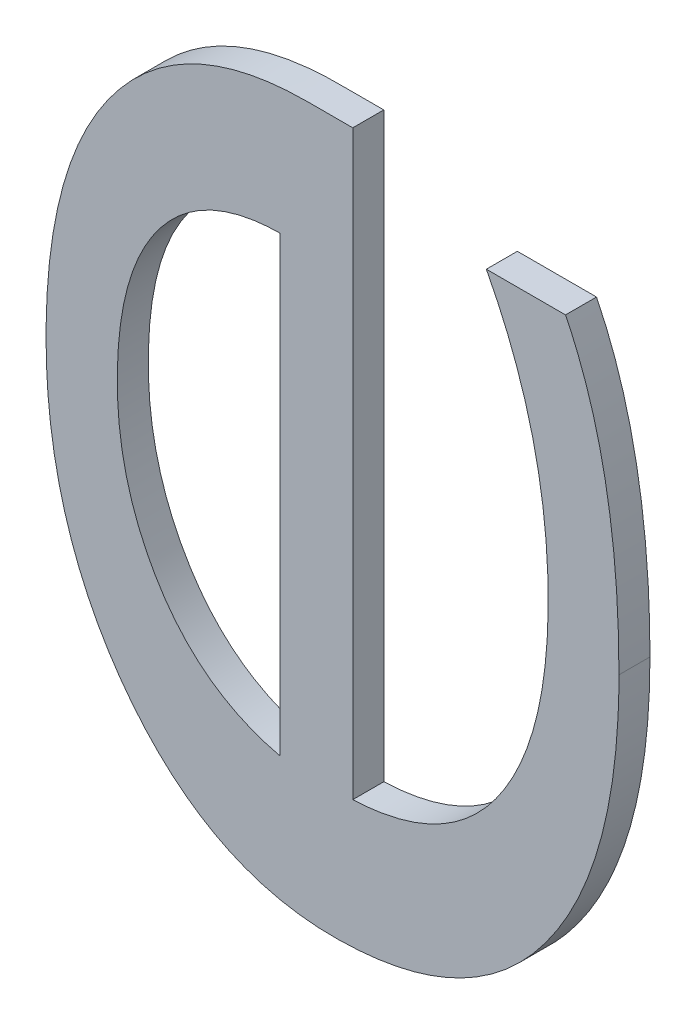
ISO-10303-21;
HEADER;
FILE_DESCRIPTION(('STEP AP214'),'2;1');
FILE_NAME('part.step','',(''),(''),'','','');
FILE_SCHEMA(('AUTOMOTIVE_DESIGN { 1 0 10303 214 1 1 1 1 }'));
ENDSEC;
DATA;
#1=APPLICATION_CONTEXT('core data for automotive mechanical design processes');
#2=APPLICATION_PROTOCOL_DEFINITION('international standard','automotive_design',2000,#1);
#3=PRODUCT_CONTEXT('',#1,'mechanical');
#4=PRODUCT('Part','Part','',(#3));
#5=PRODUCT_RELATED_PRODUCT_CATEGORY('part','',(#4));
#6=PRODUCT_DEFINITION_FORMATION('','',#4);
#7=PRODUCT_DEFINITION_CONTEXT('part definition',#1,'design');
#8=PRODUCT_DEFINITION('design','',#6,#7);
#9=PRODUCT_DEFINITION_SHAPE('','',#8);
#10=(LENGTH_UNIT() NAMED_UNIT(*) SI_UNIT(.MILLI.,.METRE.));
#11=(NAMED_UNIT(*) PLANE_ANGLE_UNIT() SI_UNIT($,.RADIAN.));
#12=(NAMED_UNIT(*) SI_UNIT($,.STERADIAN.) SOLID_ANGLE_UNIT());
#13=UNCERTAINTY_MEASURE_WITH_UNIT(LENGTH_MEASURE(1.E-05),#10,'distance_accuracy_value','');
#14=(GEOMETRIC_REPRESENTATION_CONTEXT(3) GLOBAL_UNCERTAINTY_ASSIGNED_CONTEXT((#13)) GLOBAL_UNIT_ASSIGNED_CONTEXT((#10,
#11,#12)) REPRESENTATION_CONTEXT('',''));
#15=CARTESIAN_POINT('',(0.,0.,0.));
#16=DIRECTION('',(0.,0.,1.));
#17=DIRECTION('',(1.,0.,0.));
#18=AXIS2_PLACEMENT_3D('',#15,#16,#17);
#19=CARTESIAN_POINT('',(-8.95983005625009,-22.7704584365744,333.160489148867));
#20=DIRECTION('',(0.,0.,1.));
#21=DIRECTION('',(1.,0.,0.));
#22=AXIS2_PLACEMENT_3D('',#19,#20,#21);
#23=PLANE('',#22);
#24=DIRECTION('',(1.,0.,0.));
#25=VECTOR('',#24,1.);
#26=CARTESIAN_POINT('',(2.66453525910038E-13,-55.8457304646788,333.160489148867));
#27=LINE('',#26,#25);
#28=CARTESIAN_POINT('',(-7.57343995709141,-55.8457304646788,333.160489148867));
#29=VERTEX_POINT('',#28);
#30=CARTESIAN_POINT('',(-6.80721399555295,-55.8457304646788,333.160489148867));
#31=VERTEX_POINT('',#30);
#32=EDGE_CURVE('E173',#29,#31,#27,.T.);
#33=ORIENTED_EDGE('',*,*,#32,.T.);
#34=CARTESIAN_POINT('',(-6.80721399555295,-55.8457304646788,333.160489148867));
#35=CARTESIAN_POINT('',(-6.46241231286064,-56.5401231164568,333.160489148867));
#36=CARTESIAN_POINT('',(-6.29001147151449,-57.459594270303,333.160489148867));
#37=CARTESIAN_POINT('',(-6.29001147151449,-58.6041438736047,333.160489148867));
#38=(BOUNDED_CURVE() B_SPLINE_CURVE(3,(#34,#35,#36,#37),.UNSPECIFIED.,.F.,
.F.) B_SPLINE_CURVE_WITH_KNOTS((4,4),(0.,1.),
.UNSPECIFIED.) CURVE() GEOMETRIC_REPRESENTATION_ITEM() RATIONAL_B_SPLINE_CURVE((1.,1.,1.,1.)) REPRESENTATION_ITEM(''));
#39=CARTESIAN_POINT('',(-6.29001147151449,-58.6041438736047,333.160489148867));
#40=VERTEX_POINT('',#39);
#41=EDGE_CURVE('E11',#31,#40,#38,.T.);
#42=ORIENTED_EDGE('',*,*,#41,.T.);
#43=CARTESIAN_POINT('',(-6.29001147151449,-58.6041438736047,333.160489148867));
#44=CARTESIAN_POINT('',(-6.29001147151449,-59.7103826581884,333.160489148867));
#45=CARTESIAN_POINT('',(-6.53105361618762,-60.5831615577967,333.160489148867));
#46=CARTESIAN_POINT('',(-7.495220558006,-61.8618014908206,333.160489148867));
#47=CARTESIAN_POINT('',(-8.17365004420736,-62.18146138415,333.160489148867));
#48=CARTESIAN_POINT('',(-9.85296219266834,-62.18146138415,333.160489148867));
#49=CARTESIAN_POINT('',(-10.5186208615181,-61.8354625575112,333.160489148867));
#50=CARTESIAN_POINT('',(-11.5721816938703,-60.4514669238973,333.160489148867));
#51=CARTESIAN_POINT('',(-11.8355718681491,-59.5858710329719,333.160489148867));
#52=CARTESIAN_POINT('',(-11.8355718681491,-57.5266386678038,333.160489148867));
#53=CARTESIAN_POINT('',(-11.6120895507701,-56.7316790243558,333.160489148867));
#54=CARTESIAN_POINT('',(-10.7181588828609,-55.591918489053,333.160489148867));
#55=CARTESIAN_POINT('',(-10.0956002891109,-55.3069778354721,333.160489148867));
#56=CARTESIAN_POINT('',(-9.15378100276449,-55.3069778354721,333.160489148867));
#57=CARTESIAN_POINT('',(-9.01011363497603,-55.3069778354721,333.160489148867));
#58=CARTESIAN_POINT('',(-8.86644626718757,-55.3069778354721,333.160489148867));
#59=(BOUNDED_CURVE() B_SPLINE_CURVE(3,(#43,#44,#45,#46,#47,#48,#49,#50,#51,#52,#53,#54,#55,#56,
#57,#58),.UNSPECIFIED.,.F.,.F.) B_SPLINE_CURVE_WITH_KNOTS((4,2,2,2,2,2,2,4),(0.,
0.172193607508208,0.344387118133516,0.50275482727622,0.661122495762255,0.816570914673487,
0.972019288363763,1.),
.UNSPECIFIED.) CURVE() GEOMETRIC_REPRESENTATION_ITEM() RATIONAL_B_SPLINE_CURVE((1.,1.,1.,1.,1.,
1.,1.,1.,1.,1.,1.,1.,1.,1.,1.,1.)) REPRESENTATION_ITEM(''));
#60=CARTESIAN_POINT('',(-8.86644626718757,-55.3069778354721,333.160489148867));
#61=VERTEX_POINT('',#60);
#62=EDGE_CURVE('E115',#40,#61,#59,.T.);
#63=ORIENTED_EDGE('',*,*,#62,.T.);
#64=DIRECTION('',(0.,-1.,0.));
#65=VECTOR('',#64,1.);
#66=CARTESIAN_POINT('',(-8.86644626718757,-50.9500000001419,333.160489148867));
#67=LINE('',#66,#65);
#68=CARTESIAN_POINT('',(-8.86644626718757,-60.9387386527798,333.160489148867));
#69=VERTEX_POINT('',#68);
#70=EDGE_CURVE('E117',#61,#69,#67,.T.);
#71=ORIENTED_EDGE('',*,*,#70,.T.);
#72=CARTESIAN_POINT('',(-8.86644626718757,-60.9387386527798,333.160489148867));
#73=CARTESIAN_POINT('',(-8.25665798141862,-60.9147941850151,333.160489148867));
#74=CARTESIAN_POINT('',(-7.78894100877411,-60.6729540223711,333.160489148867));
#75=CARTESIAN_POINT('',(-7.13764894146642,-59.753482868525,333.160489148867));
#76=CARTESIAN_POINT('',(-6.97482592463949,-59.1237410934524,333.160489148867));
#77=CARTESIAN_POINT('',(-6.97482592463949,-57.4284661535486,333.160489148867));
#78=CARTESIAN_POINT('',(-7.17436418487931,-56.6023787887649,333.160489148867));
#79=CARTESIAN_POINT('',(-7.57343995709141,-55.8457304646788,333.160489148867));
#80=(BOUNDED_CURVE() B_SPLINE_CURVE(3,(#72,#73,#74,#75,#76,#77,#78,#79),.UNSPECIFIED.,.F.,
.F.) B_SPLINE_CURVE_WITH_KNOTS((4,2,2,4),(0.,0.320537488518304,0.641074977036608,1.),
.UNSPECIFIED.) CURVE() GEOMETRIC_REPRESENTATION_ITEM() RATIONAL_B_SPLINE_CURVE((1.,1.,1.,1.,1.,
1.,1.,1.)) REPRESENTATION_ITEM(''));
#81=EDGE_CURVE('E56',#69,#29,#80,.T.);
#82=ORIENTED_EDGE('',*,*,#81,.T.);
#83=EDGE_LOOP('',(#33,#42,#63,#71,#82));
#84=FACE_BOUND('',#83,.T.);
#85=DIRECTION('',(0.,1.,0.));
#86=VECTOR('',#85,1.);
#87=CARTESIAN_POINT('',(-9.57041636935103,-50.9500000001419,333.160489148867));
#88=LINE('',#87,#86);
#89=CARTESIAN_POINT('',(-9.57041636935103,-60.9243719160009,333.160489148867));
#90=VERTEX_POINT('',#89);
#91=CARTESIAN_POINT('',(-9.57041636935103,-56.5425171984528,333.160489148867));
#92=VERTEX_POINT('',#91);
#93=EDGE_CURVE('E151',#90,#92,#88,.T.);
#94=ORIENTED_EDGE('',*,*,#93,.T.);
#95=CARTESIAN_POINT('',(-9.57041636935103,-56.5425171984528,333.160489148867));
#96=CARTESIAN_POINT('',(-10.068463244351,-56.5473064848462,333.160489148867));
#97=CARTESIAN_POINT('',(-10.4555672407841,-56.7268903011469,333.160489148867));
#98=CARTESIAN_POINT('',(-11.0078880745677,-57.435649521938,333.160489148867));
#99=CARTESIAN_POINT('',(-11.1459685027645,-57.9313019408082,333.160489148867));
#100=CARTESIAN_POINT('',(-11.1459685027645,-59.1476855612171,333.160489148867));
#101=CARTESIAN_POINT('',(-11.0070900472356,-59.6565073952678,333.160489148867));
#102=CARTESIAN_POINT('',(-10.4515762251203,-60.5328783387774,333.160489148867));
#103=CARTESIAN_POINT('',(-10.0652703867554,-60.8094380217702,333.160489148867));
#104=CARTESIAN_POINT('',(-9.57041636935103,-60.9243719160009,333.160489148867));
#105=(BOUNDED_CURVE() B_SPLINE_CURVE(3,(#95,#96,#97,#98,#99,#100,#101,#102,#103,#104),
.UNSPECIFIED.,.F.,.F.) B_SPLINE_CURVE_WITH_KNOTS((4,2,2,2,4),(0.,0.261810896992433,
0.523621917927962,0.761810958963981,1.),
.UNSPECIFIED.) CURVE() GEOMETRIC_REPRESENTATION_ITEM() RATIONAL_B_SPLINE_CURVE((1.,1.,1.,1.,1.,
1.,1.,1.,1.,1.)) REPRESENTATION_ITEM(''));
#106=EDGE_CURVE('E153',#92,#90,#105,.T.);
#107=ORIENTED_EDGE('',*,*,#106,.T.);
#108=EDGE_LOOP('',(#94,#107));
#109=FACE_BOUND('',#108,.T.);
#110=ADVANCED_FACE('F42',(#84,#109),#23,.F.);
#111=CARTESIAN_POINT('',(-6.80721399555295,-55.8457304646788,332.960489148867));
#112=CARTESIAN_POINT('',(-6.46241231286064,-56.5401231164568,332.960489148867));
#113=CARTESIAN_POINT('',(-6.29001147151449,-57.459594270303,332.960489148867));
#114=CARTESIAN_POINT('',(-6.29001147151449,-58.6041438736047,332.960489148867));
#115=(BOUNDED_CURVE() B_SPLINE_CURVE(3,(#111,#112,#113,#114),.UNSPECIFIED.,.F.,
.F.) B_SPLINE_CURVE_WITH_KNOTS((4,4),(0.,1.),
.UNSPECIFIED.) CURVE() GEOMETRIC_REPRESENTATION_ITEM() RATIONAL_B_SPLINE_CURVE((1.,1.,1.,1.)) REPRESENTATION_ITEM(''));
#116=DIRECTION('',(0.,0.,1.));
#117=VECTOR('',#116,1.);
#118=SURFACE_OF_LINEAR_EXTRUSION('',#115,#117);
#119=ORIENTED_EDGE('',*,*,#41,.F.);
#120=CARTESIAN_POINT('',(-6.80721399555295,-55.8457304646788,333.160489148867));
#121=CARTESIAN_POINT('',(-6.80721399555295,-55.8457304646788,333.460489148867));
#122=(BOUNDED_CURVE() B_SPLINE_CURVE(1,(#120,#121),.UNSPECIFIED.,.F.,
.F.) B_SPLINE_CURVE_WITH_KNOTS((2,2),(0.,1.),
.UNSPECIFIED.) CURVE() GEOMETRIC_REPRESENTATION_ITEM() RATIONAL_B_SPLINE_CURVE((1.,1.)) REPRESENTATION_ITEM(''));
#123=CARTESIAN_POINT('',(-6.80721399555295,-55.8457304646788,333.460489148867));
#124=VERTEX_POINT('',#123);
#125=EDGE_CURVE('E132',#31,#124,#122,.T.);
#126=ORIENTED_EDGE('',*,*,#125,.T.);
#127=CARTESIAN_POINT('',(-6.29001147151449,-58.6041438736047,333.460489148867));
#128=CARTESIAN_POINT('',(-6.29001147151449,-57.459594270303,333.460489148867));
#129=CARTESIAN_POINT('',(-6.46241231286064,-56.5401231164568,333.460489148867));
#130=CARTESIAN_POINT('',(-6.80721399555295,-55.8457304646788,333.460489148867));
#131=(BOUNDED_CURVE() B_SPLINE_CURVE(3,(#127,#128,#129,#130),.UNSPECIFIED.,.F.,
.F.) B_SPLINE_CURVE_WITH_KNOTS((4,4),(0.,1.),
.UNSPECIFIED.) CURVE() GEOMETRIC_REPRESENTATION_ITEM() RATIONAL_B_SPLINE_CURVE((1.,1.,1.,1.)) REPRESENTATION_ITEM(''));
#132=CARTESIAN_POINT('',(-6.29001147151449,-58.6041438736047,333.460489148867));
#133=VERTEX_POINT('',#132);
#134=EDGE_CURVE('E162',#133,#124,#131,.T.);
#135=ORIENTED_EDGE('',*,*,#134,.F.);
#136=CARTESIAN_POINT('',(-6.29001147151449,-58.6041438736047,333.160489148867));
#137=CARTESIAN_POINT('',(-6.29001147151449,-58.6041438736047,333.460489148867));
#138=(BOUNDED_CURVE() B_SPLINE_CURVE(1,(#136,#137),.UNSPECIFIED.,.F.,
.F.) B_SPLINE_CURVE_WITH_KNOTS((2,2),(0.,1.),
.UNSPECIFIED.) CURVE() GEOMETRIC_REPRESENTATION_ITEM() RATIONAL_B_SPLINE_CURVE((1.,1.)) REPRESENTATION_ITEM(''));
#139=EDGE_CURVE('E121',#40,#133,#138,.T.);
#140=ORIENTED_EDGE('',*,*,#139,.F.);
#141=EDGE_LOOP('',(#119,#126,#135,#140));
#142=FACE_BOUND('',#141,.T.);
#143=ADVANCED_FACE('F279',(#142),#118,.F.);
#144=CARTESIAN_POINT('',(-8.86644626718757,-60.9387386527798,332.960489148867));
#145=CARTESIAN_POINT('',(-8.25665798141862,-60.9147941850151,332.960489148867));
#146=CARTESIAN_POINT('',(-7.78894100877411,-60.6729540223711,332.960489148867));
#147=CARTESIAN_POINT('',(-7.13764894146642,-59.753482868525,332.960489148867));
#148=CARTESIAN_POINT('',(-6.97482592463949,-59.1237410934524,332.960489148867));
#149=CARTESIAN_POINT('',(-6.97482592463949,-57.4284661535486,332.960489148867));
#150=CARTESIAN_POINT('',(-7.17436418487931,-56.6023787887649,332.960489148867));
#151=CARTESIAN_POINT('',(-7.57343995709141,-55.8457304646788,332.960489148867));
#152=(BOUNDED_CURVE() B_SPLINE_CURVE(3,(#144,#145,#146,#147,#148,#149,#150,#151),.UNSPECIFIED.,
.F.,.F.) B_SPLINE_CURVE_WITH_KNOTS((4,2,2,4),(0.,0.320537488518304,0.641074977036608,1.),
.UNSPECIFIED.) CURVE() GEOMETRIC_REPRESENTATION_ITEM() RATIONAL_B_SPLINE_CURVE((1.,1.,1.,1.,1.,
1.,1.,1.)) REPRESENTATION_ITEM(''));
#153=DIRECTION('',(0.,0.,1.));
#154=VECTOR('',#153,1.);
#155=SURFACE_OF_LINEAR_EXTRUSION('',#152,#154);
#156=ORIENTED_EDGE('',*,*,#81,.F.);
#157=CARTESIAN_POINT('',(-8.86644626718757,-60.9387386527798,333.160489148867));
#158=CARTESIAN_POINT('',(-8.86644626718757,-60.9387386527798,333.460489148867));
#159=(BOUNDED_CURVE() B_SPLINE_CURVE(1,(#157,#158),.UNSPECIFIED.,.F.,
.F.) B_SPLINE_CURVE_WITH_KNOTS((2,2),(0.,1.),
.UNSPECIFIED.) CURVE() GEOMETRIC_REPRESENTATION_ITEM() RATIONAL_B_SPLINE_CURVE((1.,1.)) REPRESENTATION_ITEM(''));
#160=CARTESIAN_POINT('',(-8.86644626718757,-60.9387386527798,333.460489148867));
#161=VERTEX_POINT('',#160);
#162=EDGE_CURVE('E122',#69,#161,#159,.T.);
#163=ORIENTED_EDGE('',*,*,#162,.T.);
#164=CARTESIAN_POINT('',(-7.57343995709141,-55.8457304646788,333.460489148867));
#165=CARTESIAN_POINT('',(-7.17436418487931,-56.6023787887649,333.460489148867));
#166=CARTESIAN_POINT('',(-6.97482592463949,-57.4284661535486,333.460489148867));
#167=CARTESIAN_POINT('',(-6.97482592463949,-59.1237410934524,333.460489148867));
#168=CARTESIAN_POINT('',(-7.13764894146642,-59.753482868525,333.460489148867));
#169=CARTESIAN_POINT('',(-7.78894100877411,-60.6729540223711,333.460489148867));
#170=CARTESIAN_POINT('',(-8.25665798141862,-60.9147941850151,333.460489148867));
#171=CARTESIAN_POINT('',(-8.86644626718757,-60.9387386527798,333.460489148867));
#172=(BOUNDED_CURVE() B_SPLINE_CURVE(3,(#164,#165,#166,#167,#168,#169,#170,#171),.UNSPECIFIED.,
.F.,.F.) B_SPLINE_CURVE_WITH_KNOTS((4,2,2,4),(0.,0.358925022963392,0.679462511481696,1.),
.UNSPECIFIED.) CURVE() GEOMETRIC_REPRESENTATION_ITEM() RATIONAL_B_SPLINE_CURVE((1.,1.,1.,1.,1.,
1.,1.,1.)) REPRESENTATION_ITEM(''));
#173=CARTESIAN_POINT('',(-7.57343995709141,-55.8457304646788,333.460489148867));
#174=VERTEX_POINT('',#173);
#175=EDGE_CURVE('E182',#174,#161,#172,.T.);
#176=ORIENTED_EDGE('',*,*,#175,.F.);
#177=CARTESIAN_POINT('',(-7.57343995709141,-55.8457304646788,333.160489148867));
#178=CARTESIAN_POINT('',(-7.57343995709141,-55.8457304646788,333.260489148867));
#179=CARTESIAN_POINT('',(-7.57343995709141,-55.8457304646788,333.360489148867));
#180=CARTESIAN_POINT('',(-7.57343995709141,-55.8457304646788,333.460489148867));
#181=(BOUNDED_CURVE() B_SPLINE_CURVE(3,(#177,#178,#179,#180),.UNSPECIFIED.,.F.,
.F.) B_SPLINE_CURVE_WITH_KNOTS((4,4),(0.,1.),
.UNSPECIFIED.) CURVE() GEOMETRIC_REPRESENTATION_ITEM() RATIONAL_B_SPLINE_CURVE((1.,1.,1.,1.)) REPRESENTATION_ITEM(''));
#182=EDGE_CURVE('E138',#29,#174,#181,.T.);
#183=ORIENTED_EDGE('',*,*,#182,.F.);
#184=EDGE_LOOP('',(#156,#163,#176,#183));
#185=FACE_BOUND('',#184,.T.);
#186=ADVANCED_FACE('F285',(#185),#155,.F.);
#187=CARTESIAN_POINT('',(-6.29001147151449,-58.6041438736047,332.960489148867));
#188=CARTESIAN_POINT('',(-6.29001147151449,-59.7103826581884,332.960489148867));
#189=CARTESIAN_POINT('',(-6.53105361618762,-60.5831615577967,332.960489148867));
#190=CARTESIAN_POINT('',(-7.495220558006,-61.8618014908206,332.960489148867));
#191=CARTESIAN_POINT('',(-8.17365004420736,-62.18146138415,332.960489148867));
#192=CARTESIAN_POINT('',(-9.85296219266834,-62.18146138415,332.960489148867));
#193=CARTESIAN_POINT('',(-10.5186208615181,-61.8354625575112,332.960489148867));
#194=CARTESIAN_POINT('',(-11.5721816938703,-60.4514669238973,332.960489148867));
#195=CARTESIAN_POINT('',(-11.8355718681491,-59.5858710329719,332.960489148867));
#196=CARTESIAN_POINT('',(-11.8355718681491,-57.5266386678038,332.960489148867));
#197=CARTESIAN_POINT('',(-11.6120895507701,-56.7316790243558,332.960489148867));
#198=CARTESIAN_POINT('',(-10.7181588828609,-55.591918489053,332.960489148867));
#199=CARTESIAN_POINT('',(-10.0956002891109,-55.3069778354721,332.960489148867));
#200=CARTESIAN_POINT('',(-9.15378100276449,-55.3069778354721,332.960489148867));
#201=CARTESIAN_POINT('',(-9.01011363497603,-55.3069778354721,332.960489148867));
#202=CARTESIAN_POINT('',(-8.86644626718757,-55.3069778354721,332.960489148867));
#203=(BOUNDED_CURVE() B_SPLINE_CURVE(3,(#187,#188,#189,#190,#191,#192,#193,#194,#195,#196,#197,
#198,#199,#200,#201,#202),.UNSPECIFIED.,.F.,.F.) B_SPLINE_CURVE_WITH_KNOTS((4,2,2,2,2,2,2,4),
(0.,0.172193607508208,0.344387118133516,0.50275482727622,0.661122495762255,0.816570914673487,
0.972019288363763,1.),
.UNSPECIFIED.) CURVE() GEOMETRIC_REPRESENTATION_ITEM() RATIONAL_B_SPLINE_CURVE((1.,1.,1.,1.,1.,
1.,1.,1.,1.,1.,1.,1.,1.,1.,1.,1.)) REPRESENTATION_ITEM(''));
#204=DIRECTION('',(0.,0.,1.));
#205=VECTOR('',#204,1.);
#206=SURFACE_OF_LINEAR_EXTRUSION('',#203,#205);
#207=ORIENTED_EDGE('',*,*,#62,.F.);
#208=ORIENTED_EDGE('',*,*,#139,.T.);
#209=CARTESIAN_POINT('',(-8.86644626718757,-55.3069778354721,333.460489148867));
#210=CARTESIAN_POINT('',(-9.01011363497603,-55.3069778354721,333.460489148867));
#211=CARTESIAN_POINT('',(-9.15378100276449,-55.3069778354721,333.460489148867));
#212=CARTESIAN_POINT('',(-10.0956002891109,-55.3069778354721,333.460489148867));
#213=CARTESIAN_POINT('',(-10.7181588828609,-55.591918489053,333.460489148867));
#214=CARTESIAN_POINT('',(-11.6120895507701,-56.7316790243558,333.460489148867));
#215=CARTESIAN_POINT('',(-11.8355718681491,-57.5266386678038,333.460489148867));
#216=CARTESIAN_POINT('',(-11.8355718681491,-59.5858710329719,333.460489148867));
#217=CARTESIAN_POINT('',(-11.5721816938703,-60.4514669238973,333.460489148867));
#218=CARTESIAN_POINT('',(-10.5186208615181,-61.8354625575112,333.460489148867));
#219=CARTESIAN_POINT('',(-9.85296219266834,-62.18146138415,333.460489148867));
#220=CARTESIAN_POINT('',(-8.17365004420736,-62.18146138415,333.460489148867));
#221=CARTESIAN_POINT('',(-7.495220558006,-61.8618014908206,333.460489148867));
#222=CARTESIAN_POINT('',(-6.53105361618762,-60.5831615577967,333.460489148867));
#223=CARTESIAN_POINT('',(-6.29001147151449,-59.7103826581884,333.460489148867));
#224=CARTESIAN_POINT('',(-6.29001147151449,-58.6041438736047,333.460489148867));
#225=(BOUNDED_CURVE() B_SPLINE_CURVE(3,(#209,#210,#211,#212,#213,#214,#215,#216,#217,#218,#219,
#220,#221,#222,#223,#224),.UNSPECIFIED.,.F.,.F.) B_SPLINE_CURVE_WITH_KNOTS((4,2,2,2,2,2,2,4),
(0.,0.0279807116362369,0.183429085326513,0.338877504237745,0.49724517272378,0.655612881866484,
0.827806392491792,1.),
.UNSPECIFIED.) CURVE() GEOMETRIC_REPRESENTATION_ITEM() RATIONAL_B_SPLINE_CURVE((1.,1.,1.,1.,1.,
1.,1.,1.,1.,1.,1.,1.,1.,1.,1.,1.)) REPRESENTATION_ITEM(''));
#226=CARTESIAN_POINT('',(-8.86644626718757,-55.3069778354721,333.460489148867));
#227=VERTEX_POINT('',#226);
#228=EDGE_CURVE('E125',#227,#133,#225,.T.);
#229=ORIENTED_EDGE('',*,*,#228,.F.);
#230=CARTESIAN_POINT('',(-8.86644626718757,-55.3069778354721,333.160489148867));
#231=CARTESIAN_POINT('',(-8.86644626718757,-55.3069778354721,333.260489148867));
#232=CARTESIAN_POINT('',(-8.86644626718757,-55.3069778354721,333.360489148867));
#233=CARTESIAN_POINT('',(-8.86644626718757,-55.3069778354721,333.460489148867));
#234=(BOUNDED_CURVE() B_SPLINE_CURVE(3,(#230,#231,#232,#233),.UNSPECIFIED.,.F.,
.F.) B_SPLINE_CURVE_WITH_KNOTS((4,4),(0.,1.),
.UNSPECIFIED.) CURVE() GEOMETRIC_REPRESENTATION_ITEM() RATIONAL_B_SPLINE_CURVE((1.,1.,1.,1.)) REPRESENTATION_ITEM(''));
#235=EDGE_CURVE('E104',#61,#227,#234,.T.);
#236=ORIENTED_EDGE('',*,*,#235,.F.);
#237=EDGE_LOOP('',(#207,#208,#229,#236));
#238=FACE_BOUND('',#237,.T.);
#239=ADVANCED_FACE('F44',(#238),#206,.F.);
#240=CARTESIAN_POINT('',(-8.86644626718757,-60.9387386527798,332.960489148867));
#241=DIRECTION('',(1.,0.,0.));
#242=DIRECTION('',(0.,1.,0.));
#243=AXIS2_PLACEMENT_3D('',#240,#241,#242);
#244=PLANE('',#243);
#245=ORIENTED_EDGE('',*,*,#70,.F.);
#246=ORIENTED_EDGE('',*,*,#235,.T.);
#247=CARTESIAN_POINT('',(-8.86644626718757,-60.9387386527798,333.460489148867));
#248=CARTESIAN_POINT('',(-8.86644626718757,-59.0614850470105,333.460489148867));
#249=CARTESIAN_POINT('',(-8.86644626718757,-57.1842314412413,333.460489148867));
#250=CARTESIAN_POINT('',(-8.86644626718757,-55.3069778354721,333.460489148867));
#251=(BOUNDED_CURVE() B_SPLINE_CURVE(3,(#247,#248,#249,#250),.UNSPECIFIED.,.F.,
.F.) B_SPLINE_CURVE_WITH_KNOTS((4,4),(0.,1.),
.UNSPECIFIED.) CURVE() GEOMETRIC_REPRESENTATION_ITEM() RATIONAL_B_SPLINE_CURVE((1.,1.,1.,1.)) REPRESENTATION_ITEM(''));
#252=EDGE_CURVE('E142',#161,#227,#251,.T.);
#253=ORIENTED_EDGE('',*,*,#252,.F.);
#254=ORIENTED_EDGE('',*,*,#162,.F.);
#255=EDGE_LOOP('',(#245,#246,#253,#254));
#256=FACE_BOUND('',#255,.T.);
#257=ADVANCED_FACE('F130',(#256),#244,.T.);
#258=CARTESIAN_POINT('',(-6.80721399555295,-55.8457304646788,332.960489148867));
#259=DIRECTION('',(0.,1.,0.));
#260=DIRECTION('',(1.,0.,0.));
#261=AXIS2_PLACEMENT_3D('',#258,#259,#260);
#262=PLANE('',#261);
#263=ORIENTED_EDGE('',*,*,#32,.F.);
#264=ORIENTED_EDGE('',*,*,#182,.T.);
#265=CARTESIAN_POINT('',(-6.80721399555295,-55.8457304646788,333.460489148867));
#266=CARTESIAN_POINT('',(-7.06262264939911,-55.8457304646788,333.460489148867));
#267=CARTESIAN_POINT('',(-7.31803130324526,-55.8457304646788,333.460489148867));
#268=CARTESIAN_POINT('',(-7.57343995709141,-55.8457304646788,333.460489148867));
#269=(BOUNDED_CURVE() B_SPLINE_CURVE(3,(#265,#266,#267,#268),.UNSPECIFIED.,.F.,
.F.) B_SPLINE_CURVE_WITH_KNOTS((4,4),(0.,1.),
.UNSPECIFIED.) CURVE() GEOMETRIC_REPRESENTATION_ITEM() RATIONAL_B_SPLINE_CURVE((1.,1.,1.,1.)) REPRESENTATION_ITEM(''));
#270=EDGE_CURVE('E171',#124,#174,#269,.T.);
#271=ORIENTED_EDGE('',*,*,#270,.F.);
#272=ORIENTED_EDGE('',*,*,#125,.F.);
#273=EDGE_LOOP('',(#263,#264,#271,#272));
#274=FACE_BOUND('',#273,.T.);
#275=ADVANCED_FACE('F283',(#274),#262,.T.);
#276=CARTESIAN_POINT('',(-6.41931210252411,-57.0561283123204,333.460489148867));
#277=DIRECTION('',(0.,0.,-1.));
#278=DIRECTION('',(0.,-1.,0.));
#279=AXIS2_PLACEMENT_3D('',#276,#277,#278);
#280=PLANE('',#279);
#281=ORIENTED_EDGE('',*,*,#134,.T.);
#282=ORIENTED_EDGE('',*,*,#270,.T.);
#283=ORIENTED_EDGE('',*,*,#175,.T.);
#284=ORIENTED_EDGE('',*,*,#252,.T.);
#285=ORIENTED_EDGE('',*,*,#228,.T.);
#286=EDGE_LOOP('',(#281,#282,#283,#284,#285));
#287=FACE_BOUND('',#286,.T.);
#288=CARTESIAN_POINT('',(-9.57041636935103,-60.9243719160009,333.460489148867));
#289=CARTESIAN_POINT('',(-10.0652703867554,-60.8094380217702,333.460489148867));
#290=CARTESIAN_POINT('',(-10.4515762251203,-60.5328783387774,333.460489148867));
#291=CARTESIAN_POINT('',(-11.0070900472356,-59.6565073952678,333.460489148867));
#292=CARTESIAN_POINT('',(-11.1459685027645,-59.1476855612171,333.460489148867));
#293=CARTESIAN_POINT('',(-11.1459685027645,-57.9313019408082,333.460489148867));
#294=CARTESIAN_POINT('',(-11.0078880745677,-57.435649521938,333.460489148867));
#295=CARTESIAN_POINT('',(-10.4555672407841,-56.7268903011469,333.460489148867));
#296=CARTESIAN_POINT('',(-10.068463244351,-56.5473064848462,333.460489148867));
#297=CARTESIAN_POINT('',(-9.57041636935103,-56.5425171984528,333.460489148867));
#298=(BOUNDED_CURVE() B_SPLINE_CURVE(3,(#288,#289,#290,#291,#292,#293,#294,#295,#296,#297),
.UNSPECIFIED.,.F.,.F.) B_SPLINE_CURVE_WITH_KNOTS((4,2,2,2,4),(0.,0.238189041036019,
0.476378082072038,0.738189103007567,1.),
.UNSPECIFIED.) CURVE() GEOMETRIC_REPRESENTATION_ITEM() RATIONAL_B_SPLINE_CURVE((1.,1.,1.,1.,1.,
1.,1.,1.,1.,1.)) REPRESENTATION_ITEM(''));
#299=CARTESIAN_POINT('',(-9.57041636935103,-60.9243719160009,333.460489148867));
#300=VERTEX_POINT('',#299);
#301=CARTESIAN_POINT('',(-9.57041636935103,-56.5425171984528,333.460489148867));
#302=VERTEX_POINT('',#301);
#303=EDGE_CURVE('E152',#300,#302,#298,.T.);
#304=ORIENTED_EDGE('',*,*,#303,.T.);
#305=CARTESIAN_POINT('',(-9.57041636935103,-56.5425171984528,333.460489148867));
#306=CARTESIAN_POINT('',(-9.57041636935103,-58.0031354376355,333.460489148867));
#307=CARTESIAN_POINT('',(-9.57041636935103,-59.4637536768182,333.460489148867));
#308=CARTESIAN_POINT('',(-9.57041636935103,-60.9243719160009,333.460489148867));
#309=(BOUNDED_CURVE() B_SPLINE_CURVE(3,(#305,#306,#307,#308),.UNSPECIFIED.,.F.,
.F.) B_SPLINE_CURVE_WITH_KNOTS((4,4),(0.,1.),
.UNSPECIFIED.) CURVE() GEOMETRIC_REPRESENTATION_ITEM() RATIONAL_B_SPLINE_CURVE((1.,1.,1.,1.)) REPRESENTATION_ITEM(''));
#310=EDGE_CURVE('E172',#302,#300,#309,.T.);
#311=ORIENTED_EDGE('',*,*,#310,.T.);
#312=EDGE_LOOP('',(#304,#311));
#313=FACE_BOUND('',#312,.T.);
#314=ADVANCED_FACE('F275',(#287,#313),#280,.F.);
#315=CARTESIAN_POINT('',(-9.57041636935103,-56.5425171984528,332.960489148867));
#316=DIRECTION('',(-1.,0.,0.));
#317=DIRECTION('',(0.,0.,1.));
#318=AXIS2_PLACEMENT_3D('',#315,#316,#317);
#319=PLANE('',#318);
#320=ORIENTED_EDGE('',*,*,#93,.F.);
#321=CARTESIAN_POINT('',(-9.57041636935103,-60.9243719160009,333.460489148867));
#322=CARTESIAN_POINT('',(-9.57041636935103,-60.9243719160009,333.160489148867));
#323=(BOUNDED_CURVE() B_SPLINE_CURVE(1,(#321,#322),.UNSPECIFIED.,.F.,
.F.) B_SPLINE_CURVE_WITH_KNOTS((2,2),(0.,1.),
.UNSPECIFIED.) CURVE() GEOMETRIC_REPRESENTATION_ITEM() RATIONAL_B_SPLINE_CURVE((1.,1.)) REPRESENTATION_ITEM(''));
#324=EDGE_CURVE('E146',#300,#90,#323,.T.);
#325=ORIENTED_EDGE('',*,*,#324,.F.);
#326=ORIENTED_EDGE('',*,*,#310,.F.);
#327=CARTESIAN_POINT('',(-9.57041636935103,-56.5425171984528,333.160489148867));
#328=CARTESIAN_POINT('',(-9.57041636935103,-56.5425171984528,333.460489148867));
#329=(BOUNDED_CURVE() B_SPLINE_CURVE(1,(#327,#328),.UNSPECIFIED.,.F.,
.F.) B_SPLINE_CURVE_WITH_KNOTS((2,2),(0.,1.),
.UNSPECIFIED.) CURVE() GEOMETRIC_REPRESENTATION_ITEM() RATIONAL_B_SPLINE_CURVE((1.,1.)) REPRESENTATION_ITEM(''));
#330=EDGE_CURVE('E47',#92,#302,#329,.T.);
#331=ORIENTED_EDGE('',*,*,#330,.F.);
#332=EDGE_LOOP('',(#320,#325,#326,#331));
#333=FACE_BOUND('',#332,.T.);
#334=ADVANCED_FACE('F303',(#333),#319,.T.);
#335=CARTESIAN_POINT('',(-9.57041636935103,-56.5425171984528,332.960489148867));
#336=CARTESIAN_POINT('',(-10.068463244351,-56.5473064848462,332.960489148867));
#337=CARTESIAN_POINT('',(-10.4555672407841,-56.7268903011469,332.960489148867));
#338=CARTESIAN_POINT('',(-11.0078880745677,-57.435649521938,332.960489148867));
#339=CARTESIAN_POINT('',(-11.1459685027645,-57.9313019408082,332.960489148867));
#340=CARTESIAN_POINT('',(-11.1459685027645,-59.1476855612171,332.960489148867));
#341=CARTESIAN_POINT('',(-11.0070900472356,-59.6565073952678,332.960489148867));
#342=CARTESIAN_POINT('',(-10.4515762251203,-60.5328783387774,332.960489148867));
#343=CARTESIAN_POINT('',(-10.0652703867554,-60.8094380217702,332.960489148867));
#344=CARTESIAN_POINT('',(-9.57041636935103,-60.9243719160009,332.960489148867));
#345=(BOUNDED_CURVE() B_SPLINE_CURVE(3,(#335,#336,#337,#338,#339,#340,#341,#342,#343,#344),
.UNSPECIFIED.,.F.,.F.) B_SPLINE_CURVE_WITH_KNOTS((4,2,2,2,4),(0.,0.261810896992433,
0.523621917927962,0.761810958963981,1.),
.UNSPECIFIED.) CURVE() GEOMETRIC_REPRESENTATION_ITEM() RATIONAL_B_SPLINE_CURVE((1.,1.,1.,1.,1.,
1.,1.,1.,1.,1.)) REPRESENTATION_ITEM(''));
#346=DIRECTION('',(0.,0.,1.));
#347=VECTOR('',#346,1.);
#348=SURFACE_OF_LINEAR_EXTRUSION('',#345,#347);
#349=ORIENTED_EDGE('',*,*,#106,.F.);
#350=ORIENTED_EDGE('',*,*,#330,.T.);
#351=ORIENTED_EDGE('',*,*,#303,.F.);
#352=ORIENTED_EDGE('',*,*,#324,.T.);
#353=EDGE_LOOP('',(#349,#350,#351,#352));
#354=FACE_BOUND('',#353,.T.);
#355=ADVANCED_FACE('F305',(#354),#348,.F.);
#356=CLOSED_SHELL('',(#110,#143,#186,#239,#257,#275,#314,#334,#355));
#357=MANIFOLD_SOLID_BREP('B2',#356);
#358=ADVANCED_BREP_SHAPE_REPRESENTATION('',(#18,#357),#14);
#359=SHAPE_DEFINITION_REPRESENTATION(#9,#358);
ENDSEC;
END-ISO-10303-21;
